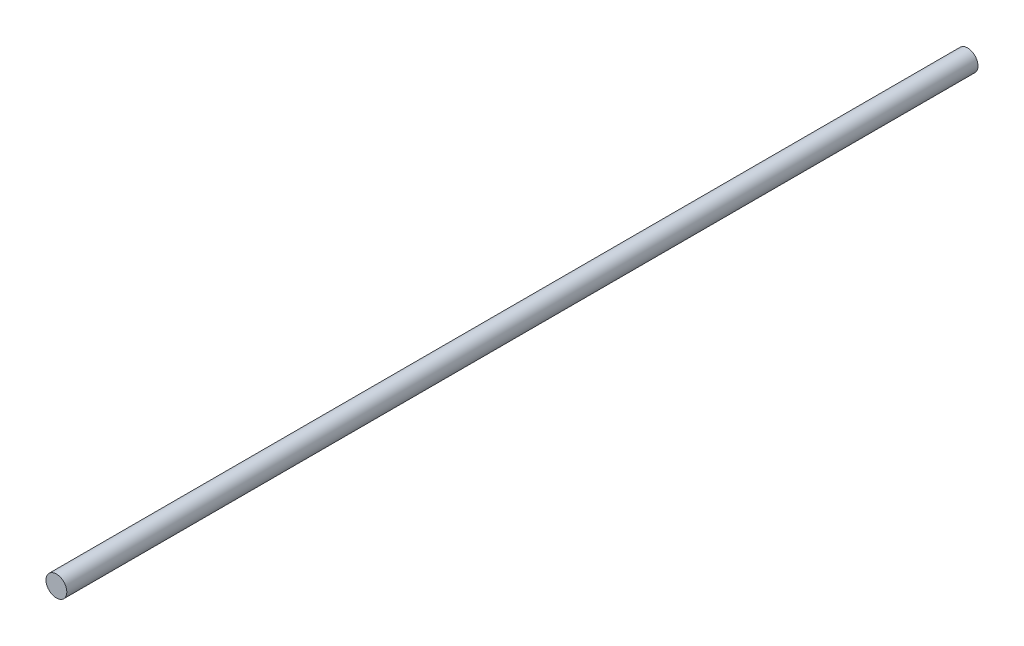
ISO-10303-21;
HEADER;
FILE_DESCRIPTION(('STEP AP214'),'2;1');
FILE_NAME('part.step','',(''),(''),'','','');
FILE_SCHEMA(('AUTOMOTIVE_DESIGN { 1 0 10303 214 1 1 1 1 }'));
ENDSEC;
DATA;
#1=APPLICATION_CONTEXT('core data for automotive mechanical design processes');
#2=APPLICATION_PROTOCOL_DEFINITION('international standard','automotive_design',2000,#1);
#3=PRODUCT_CONTEXT('',#1,'mechanical');
#4=PRODUCT('Part','Part','',(#3));
#5=PRODUCT_RELATED_PRODUCT_CATEGORY('part','',(#4));
#6=PRODUCT_DEFINITION_FORMATION('','',#4);
#7=PRODUCT_DEFINITION_CONTEXT('part definition',#1,'design');
#8=PRODUCT_DEFINITION('design','',#6,#7);
#9=PRODUCT_DEFINITION_SHAPE('','',#8);
#10=(LENGTH_UNIT() NAMED_UNIT(*) SI_UNIT(.MILLI.,.METRE.));
#11=(NAMED_UNIT(*) PLANE_ANGLE_UNIT() SI_UNIT($,.RADIAN.));
#12=(NAMED_UNIT(*) SI_UNIT($,.STERADIAN.) SOLID_ANGLE_UNIT());
#13=UNCERTAINTY_MEASURE_WITH_UNIT(LENGTH_MEASURE(1.E-05),#10,'distance_accuracy_value','');
#14=(GEOMETRIC_REPRESENTATION_CONTEXT(3) GLOBAL_UNCERTAINTY_ASSIGNED_CONTEXT((#13)) GLOBAL_UNIT_ASSIGNED_CONTEXT((#10,
#11,#12)) REPRESENTATION_CONTEXT('',''));
#15=CARTESIAN_POINT('',(0.,0.,0.));
#16=DIRECTION('',(0.,0.,1.));
#17=DIRECTION('',(1.,0.,0.));
#18=AXIS2_PLACEMENT_3D('',#15,#16,#17);
#19=CARTESIAN_POINT('',(0.,0.,525.));
#20=DIRECTION('',(0.,0.,-1.));
#21=DIRECTION('',(-1.,0.,0.));
#22=AXIS2_PLACEMENT_3D('',#19,#20,#21);
#23=CYLINDRICAL_SURFACE('',#22,6.);
#24=CARTESIAN_POINT('',(0.,0.,525.));
#25=DIRECTION('',(0.,0.,1.));
#26=DIRECTION('',(1.,0.,0.));
#27=AXIS2_PLACEMENT_3D('',#24,#25,#26);
#28=CIRCLE('',#27,6.);
#29=CARTESIAN_POINT('',(6.,0.,525.));
#30=VERTEX_POINT('',#29);
#31=EDGE_CURVE('E10',#30,#30,#28,.T.);
#32=ORIENTED_EDGE('',*,*,#31,.F.);
#33=EDGE_LOOP('',(#32));
#34=FACE_BOUND('',#33,.T.);
#35=CARTESIAN_POINT('',(0.,0.,0.));
#36=DIRECTION('',(0.,0.,1.));
#37=DIRECTION('',(1.,0.,0.));
#38=AXIS2_PLACEMENT_3D('',#35,#36,#37);
#39=CIRCLE('',#38,6.);
#40=CARTESIAN_POINT('',(6.,0.,0.));
#41=VERTEX_POINT('',#40);
#42=EDGE_CURVE('E40',#41,#41,#39,.T.);
#43=ORIENTED_EDGE('',*,*,#42,.T.);
#44=EDGE_LOOP('',(#43));
#45=FACE_BOUND('',#44,.T.);
#46=ADVANCED_FACE('F37',(#34,#45),#23,.T.);
#47=CARTESIAN_POINT('',(0.,0.,525.));
#48=DIRECTION('',(0.,0.,1.));
#49=DIRECTION('',(1.,0.,0.));
#50=AXIS2_PLACEMENT_3D('',#47,#48,#49);
#51=PLANE('',#50);
#52=ORIENTED_EDGE('',*,*,#31,.T.);
#53=EDGE_LOOP('',(#52));
#54=FACE_BOUND('',#53,.T.);
#55=ADVANCED_FACE('F54',(#54),#51,.T.);
#56=CARTESIAN_POINT('',(0.,0.,0.));
#57=DIRECTION('',(0.,0.,1.));
#58=DIRECTION('',(1.,0.,0.));
#59=AXIS2_PLACEMENT_3D('',#56,#57,#58);
#60=PLANE('',#59);
#61=ORIENTED_EDGE('',*,*,#42,.F.);
#62=EDGE_LOOP('',(#61));
#63=FACE_BOUND('',#62,.T.);
#64=ADVANCED_FACE('F52',(#63),#60,.F.);
#65=CLOSED_SHELL('',(#46,#55,#64));
#66=MANIFOLD_SOLID_BREP('B2',#65);
#67=ADVANCED_BREP_SHAPE_REPRESENTATION('',(#18,#66),#14);
#68=SHAPE_DEFINITION_REPRESENTATION(#9,#67);
ENDSEC;
END-ISO-10303-21;
